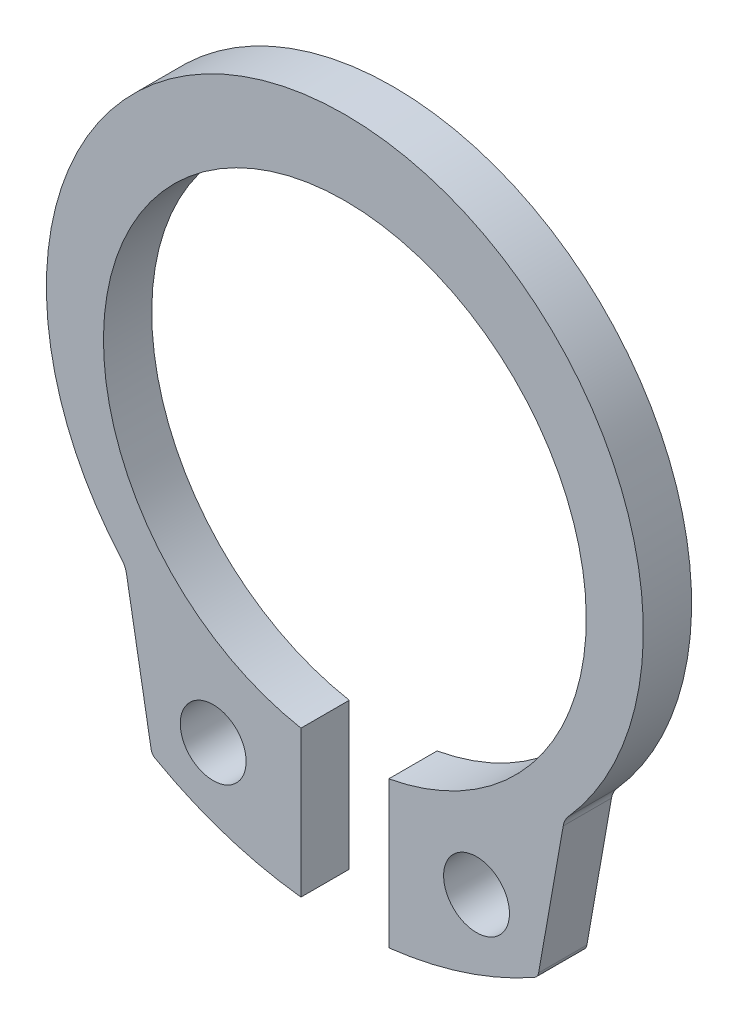
ISO-10303-21;
HEADER;
FILE_DESCRIPTION(('STEP AP214'),'2;1');
FILE_NAME('part.step','',(''),(''),'','','');
FILE_SCHEMA(('AUTOMOTIVE_DESIGN { 1 0 10303 214 1 1 1 1 }'));
ENDSEC;
DATA;
#1=APPLICATION_CONTEXT('core data for automotive mechanical design processes');
#2=APPLICATION_PROTOCOL_DEFINITION('international standard','automotive_design',2000,#1);
#3=PRODUCT_CONTEXT('',#1,'mechanical');
#4=PRODUCT('Part','Part','',(#3));
#5=PRODUCT_RELATED_PRODUCT_CATEGORY('part','',(#4));
#6=PRODUCT_DEFINITION_FORMATION('','',#4);
#7=PRODUCT_DEFINITION_CONTEXT('part definition',#1,'design');
#8=PRODUCT_DEFINITION('design','',#6,#7);
#9=PRODUCT_DEFINITION_SHAPE('','',#8);
#10=(LENGTH_UNIT() NAMED_UNIT(*) SI_UNIT(.MILLI.,.METRE.));
#11=(NAMED_UNIT(*) PLANE_ANGLE_UNIT() SI_UNIT($,.RADIAN.));
#12=(NAMED_UNIT(*) SI_UNIT($,.STERADIAN.) SOLID_ANGLE_UNIT());
#13=UNCERTAINTY_MEASURE_WITH_UNIT(LENGTH_MEASURE(1.E-05),#10,'distance_accuracy_value','');
#14=(GEOMETRIC_REPRESENTATION_CONTEXT(3) GLOBAL_UNCERTAINTY_ASSIGNED_CONTEXT((#13)) GLOBAL_UNIT_ASSIGNED_CONTEXT((#10,
#11,#12)) REPRESENTATION_CONTEXT('',''));
#15=CARTESIAN_POINT('',(0.,0.,0.));
#16=DIRECTION('',(0.,0.,1.));
#17=DIRECTION('',(1.,0.,0.));
#18=AXIS2_PLACEMENT_3D('',#15,#16,#17);
#19=CARTESIAN_POINT('',(5.46744745290776,-4.83704644899059,1.1));
#20=DIRECTION('',(0.,0.,-1.));
#21=DIRECTION('',(-1.,0.,0.));
#22=AXIS2_PLACEMENT_3D('',#19,#20,#21);
#23=CYLINDRICAL_SURFACE('',#22,0.500000000000001);
#24=CARTESIAN_POINT('',(5.46744745290776,-4.83704644899059,0.));
#25=DIRECTION('',(0.,0.,1.));
#26=DIRECTION('',(1.,0.,0.));
#27=AXIS2_PLACEMENT_3D('',#24,#25,#26);
#28=CIRCLE('',#27,0.500000000000001);
#29=CARTESIAN_POINT('',(4.97504357640166,-4.75022236015712,0.));
#30=VERTEX_POINT('',#29);
#31=CARTESIAN_POINT('',(5.0929647506538,-4.50574189768986,0.));
#32=VERTEX_POINT('',#31);
#33=EDGE_CURVE('E169',#30,#32,#28,.F.);
#34=ORIENTED_EDGE('',*,*,#33,.T.);
#35=DIRECTION('',(0.,0.,-1.));
#36=VECTOR('',#35,1.);
#37=CARTESIAN_POINT('',(5.0929647506538,-4.50574189768986,1.1));
#38=LINE('',#37,#36);
#39=CARTESIAN_POINT('',(5.0929647506538,-4.50574189768986,1.1));
#40=VERTEX_POINT('',#39);
#41=EDGE_CURVE('E11',#40,#32,#38,.T.);
#42=ORIENTED_EDGE('',*,*,#41,.F.);
#43=CARTESIAN_POINT('',(5.46744745290776,-4.83704644899059,1.1));
#44=DIRECTION('',(0.,0.,1.));
#45=DIRECTION('',(1.,0.,0.));
#46=AXIS2_PLACEMENT_3D('',#43,#44,#45);
#47=CIRCLE('',#46,0.500000000000001);
#48=CARTESIAN_POINT('',(4.97504357640166,-4.75022236015712,1.1));
#49=VERTEX_POINT('',#48);
#50=EDGE_CURVE('E306',#49,#40,#47,.F.);
#51=ORIENTED_EDGE('',*,*,#50,.F.);
#52=DIRECTION('',(0.,0.,-1.));
#53=VECTOR('',#52,1.);
#54=CARTESIAN_POINT('',(4.97504357640166,-4.75022236015712,1.1));
#55=LINE('',#54,#53);
#56=EDGE_CURVE('E58',#49,#30,#55,.T.);
#57=ORIENTED_EDGE('',*,*,#56,.T.);
#58=EDGE_LOOP('',(#34,#42,#51,#57));
#59=FACE_BOUND('',#58,.T.);
#60=ADVANCED_FACE('F41',(#59),#23,.F.);
#61=CARTESIAN_POINT('',(0.,0.,1.1));
#62=DIRECTION('',(0.,0.,-1.));
#63=DIRECTION('',(-1.,0.,0.));
#64=AXIS2_PLACEMENT_3D('',#61,#62,#63);
#65=CYLINDRICAL_SURFACE('',#64,6.8);
#66=CARTESIAN_POINT('',(0.,0.,0.));
#67=DIRECTION('',(0.,0.,1.));
#68=DIRECTION('',(1.,0.,0.));
#69=AXIS2_PLACEMENT_3D('',#66,#67,#68);
#70=CIRCLE('',#69,6.8);
#71=CARTESIAN_POINT('',(-5.0929647506538,-4.50574189768986,0.));
#72=VERTEX_POINT('',#71);
#73=EDGE_CURVE('E171',#32,#72,#70,.T.);
#74=ORIENTED_EDGE('',*,*,#73,.T.);
#75=DIRECTION('',(0.,0.,-1.));
#76=VECTOR('',#75,1.);
#77=CARTESIAN_POINT('',(-5.0929647506538,-4.50574189768986,1.1));
#78=LINE('',#77,#76);
#79=CARTESIAN_POINT('',(-5.0929647506538,-4.50574189768986,1.1));
#80=VERTEX_POINT('',#79);
#81=EDGE_CURVE('E50',#80,#72,#78,.T.);
#82=ORIENTED_EDGE('',*,*,#81,.F.);
#83=CARTESIAN_POINT('',(0.,0.,1.1));
#84=DIRECTION('',(0.,0.,1.));
#85=DIRECTION('',(1.,0.,0.));
#86=AXIS2_PLACEMENT_3D('',#83,#84,#85);
#87=CIRCLE('',#86,6.8);
#88=EDGE_CURVE('E108',#40,#80,#87,.T.);
#89=ORIENTED_EDGE('',*,*,#88,.F.);
#90=ORIENTED_EDGE('',*,*,#41,.T.);
#91=EDGE_LOOP('',(#74,#82,#89,#90));
#92=FACE_BOUND('',#91,.T.);
#93=ADVANCED_FACE('F222',(#92),#65,.T.);
#94=CARTESIAN_POINT('',(-5.46744745290776,-4.83704644899059,1.1));
#95=DIRECTION('',(0.,0.,-1.));
#96=DIRECTION('',(-1.,0.,0.));
#97=AXIS2_PLACEMENT_3D('',#94,#95,#96);
#98=CYLINDRICAL_SURFACE('',#97,0.500000000000001);
#99=CARTESIAN_POINT('',(-5.46744745290776,-4.83704644899059,0.));
#100=DIRECTION('',(0.,0.,1.));
#101=DIRECTION('',(1.,0.,0.));
#102=AXIS2_PLACEMENT_3D('',#99,#100,#101);
#103=CIRCLE('',#102,0.500000000000001);
#104=CARTESIAN_POINT('',(-4.97504357640166,-4.75022236015712,0.));
#105=VERTEX_POINT('',#104);
#106=EDGE_CURVE('E174',#105,#72,#103,.T.);
#107=ORIENTED_EDGE('',*,*,#106,.F.);
#108=DIRECTION('',(0.,0.,-1.));
#109=VECTOR('',#108,1.);
#110=CARTESIAN_POINT('',(-4.97504357640166,-4.75022236015712,1.1));
#111=LINE('',#110,#109);
#112=CARTESIAN_POINT('',(-4.97504357640166,-4.75022236015712,1.1));
#113=VERTEX_POINT('',#112);
#114=EDGE_CURVE('E215',#113,#105,#111,.T.);
#115=ORIENTED_EDGE('',*,*,#114,.F.);
#116=CARTESIAN_POINT('',(-5.46744745290776,-4.83704644899059,1.1));
#117=DIRECTION('',(0.,0.,1.));
#118=DIRECTION('',(1.,0.,0.));
#119=AXIS2_PLACEMENT_3D('',#116,#117,#118);
#120=CIRCLE('',#119,0.500000000000001);
#121=EDGE_CURVE('E221',#113,#80,#120,.T.);
#122=ORIENTED_EDGE('',*,*,#121,.T.);
#123=ORIENTED_EDGE('',*,*,#81,.T.);
#124=EDGE_LOOP('',(#107,#115,#122,#123));
#125=FACE_BOUND('',#124,.T.);
#126=ADVANCED_FACE('F219',(#125),#98,.F.);
#127=CARTESIAN_POINT('',(-5.63736352284218,-0.994019289138806,1.1));
#128=DIRECTION('',(0.984807753012208,0.173648177666932,0.));
#129=DIRECTION('',(-0.173648177666932,0.984807753012208,0.));
#130=AXIS2_PLACEMENT_3D('',#127,#128,#129);
#131=PLANE('',#130);
#132=DIRECTION('',(0.173648177666932,-0.984807753012208,0.));
#133=VECTOR('',#132,1.);
#134=CARTESIAN_POINT('',(-5.63736352284218,-0.994019289138806,0.));
#135=LINE('',#134,#133);
#136=CARTESIAN_POINT('',(-4.41443549590344,-7.92958877501741,0.));
#137=VERTEX_POINT('',#136);
#138=EDGE_CURVE('E177',#105,#137,#135,.T.);
#139=ORIENTED_EDGE('',*,*,#138,.T.);
#140=DIRECTION('',(0.,0.,-1.));
#141=VECTOR('',#140,1.);
#142=CARTESIAN_POINT('',(-4.41443549590344,-7.92958877501741,1.1));
#143=LINE('',#142,#141);
#144=CARTESIAN_POINT('',(-4.41443549590344,-7.92958877501741,1.1));
#145=VERTEX_POINT('',#144);
#146=EDGE_CURVE('E212',#145,#137,#143,.T.);
#147=ORIENTED_EDGE('',*,*,#146,.F.);
#148=DIRECTION('',(0.173648177666932,-0.984807753012208,0.));
#149=VECTOR('',#148,1.);
#150=CARTESIAN_POINT('',(-5.63736352284218,-0.994019289138806,1.1));
#151=LINE('',#150,#149);
#152=EDGE_CURVE('E240',#113,#145,#151,.T.);
#153=ORIENTED_EDGE('',*,*,#152,.F.);
#154=ORIENTED_EDGE('',*,*,#114,.T.);
#155=EDGE_LOOP('',(#139,#147,#153,#154));
#156=FACE_BOUND('',#155,.T.);
#157=ADVANCED_FACE('F231',(#156),#131,.F.);
#158=CARTESIAN_POINT('',(-4.217473945301,-7.89485913948402,1.1));
#159=DIRECTION('',(0.,0.,-1.));
#160=DIRECTION('',(-1.,0.,0.));
#161=AXIS2_PLACEMENT_3D('',#158,#159,#160);
#162=CYLINDRICAL_SURFACE('',#161,0.200000000000001);
#163=CARTESIAN_POINT('',(-4.217473945301,-7.89485913948402,0.));
#164=DIRECTION('',(0.,0.,1.));
#165=DIRECTION('',(1.,0.,0.));
#166=AXIS2_PLACEMENT_3D('',#163,#164,#165);
#167=CIRCLE('',#166,0.200000000000001);
#168=CARTESIAN_POINT('',(-4.3155547347266,-8.06915818923947,0.));
#169=VERTEX_POINT('',#168);
#170=EDGE_CURVE('E179',#137,#169,#167,.T.);
#171=ORIENTED_EDGE('',*,*,#170,.T.);
#172=DIRECTION('',(0.,0.,-1.));
#173=VECTOR('',#172,1.);
#174=CARTESIAN_POINT('',(-4.3155547347266,-8.06915818923947,1.1));
#175=LINE('',#174,#173);
#176=CARTESIAN_POINT('',(-4.3155547347266,-8.06915818923947,1.1));
#177=VERTEX_POINT('',#176);
#178=EDGE_CURVE('E209',#177,#169,#175,.T.);
#179=ORIENTED_EDGE('',*,*,#178,.F.);
#180=CARTESIAN_POINT('',(-4.217473945301,-7.89485913948402,1.1));
#181=DIRECTION('',(0.,0.,1.));
#182=DIRECTION('',(1.,0.,0.));
#183=AXIS2_PLACEMENT_3D('',#180,#181,#182);
#184=CIRCLE('',#183,0.200000000000001);
#185=EDGE_CURVE('E237',#145,#177,#184,.T.);
#186=ORIENTED_EDGE('',*,*,#185,.F.);
#187=ORIENTED_EDGE('',*,*,#146,.T.);
#188=EDGE_LOOP('',(#171,#179,#186,#187));
#189=FACE_BOUND('',#188,.T.);
#190=ADVANCED_FACE('F235',(#189),#162,.T.);
#191=CARTESIAN_POINT('',(0.,-0.4,1.1));
#192=DIRECTION('',(0.,0.,-1.));
#193=DIRECTION('',(-1.,0.,0.));
#194=AXIS2_PLACEMENT_3D('',#191,#192,#193);
#195=CYLINDRICAL_SURFACE('',#194,8.8);
#196=CARTESIAN_POINT('',(0.,-0.4,0.));
#197=DIRECTION('',(0.,0.,1.));
#198=DIRECTION('',(1.,0.,0.));
#199=AXIS2_PLACEMENT_3D('',#196,#197,#198);
#200=CIRCLE('',#199,8.8);
#201=CARTESIAN_POINT('',(-0.999999999999999,-9.14299719775776,0.));
#202=VERTEX_POINT('',#201);
#203=EDGE_CURVE('E181',#169,#202,#200,.T.);
#204=ORIENTED_EDGE('',*,*,#203,.T.);
#205=DIRECTION('',(0.,0.,-1.));
#206=VECTOR('',#205,1.);
#207=CARTESIAN_POINT('',(-0.999999999999999,-9.14299719775776,1.1));
#208=LINE('',#207,#206);
#209=CARTESIAN_POINT('',(-0.999999999999999,-9.14299719775776,1.1));
#210=VERTEX_POINT('',#209);
#211=EDGE_CURVE('E207',#210,#202,#208,.T.);
#212=ORIENTED_EDGE('',*,*,#211,.F.);
#213=CARTESIAN_POINT('',(0.,-0.4,1.1));
#214=DIRECTION('',(0.,0.,1.));
#215=DIRECTION('',(1.,0.,0.));
#216=AXIS2_PLACEMENT_3D('',#213,#214,#215);
#217=CIRCLE('',#216,8.8);
#218=EDGE_CURVE('E239',#177,#210,#217,.T.);
#219=ORIENTED_EDGE('',*,*,#218,.F.);
#220=ORIENTED_EDGE('',*,*,#178,.T.);
#221=EDGE_LOOP('',(#204,#212,#219,#220));
#222=FACE_BOUND('',#221,.T.);
#223=ADVANCED_FACE('F375',(#222),#195,.T.);
#224=CARTESIAN_POINT('',(-1.,0.,1.1));
#225=DIRECTION('',(1.,0.,0.));
#226=DIRECTION('',(0.,1.,0.));
#227=AXIS2_PLACEMENT_3D('',#224,#225,#226);
#228=PLANE('',#227);
#229=DIRECTION('',(0.,-1.,0.));
#230=VECTOR('',#229,1.);
#231=CARTESIAN_POINT('',(-1.,0.,0.));
#232=LINE('',#231,#230);
#233=CARTESIAN_POINT('',(-0.999999999999999,-5.80832691319598,0.));
#234=VERTEX_POINT('',#233);
#235=EDGE_CURVE('E184',#234,#202,#232,.T.);
#236=ORIENTED_EDGE('',*,*,#235,.F.);
#237=DIRECTION('',(0.,0.,-1.));
#238=VECTOR('',#237,1.);
#239=CARTESIAN_POINT('',(-0.999999999999999,-5.80832691319598,1.1));
#240=LINE('',#239,#238);
#241=CARTESIAN_POINT('',(-0.999999999999999,-5.80832691319598,1.1));
#242=VERTEX_POINT('',#241);
#243=EDGE_CURVE('E205',#242,#234,#240,.T.);
#244=ORIENTED_EDGE('',*,*,#243,.F.);
#245=DIRECTION('',(0.,-1.,0.));
#246=VECTOR('',#245,1.);
#247=CARTESIAN_POINT('',(-1.,0.,1.1));
#248=LINE('',#247,#246);
#249=EDGE_CURVE('E242',#242,#210,#248,.T.);
#250=ORIENTED_EDGE('',*,*,#249,.T.);
#251=ORIENTED_EDGE('',*,*,#211,.T.);
#252=EDGE_LOOP('',(#236,#244,#250,#251));
#253=FACE_BOUND('',#252,.T.);
#254=ADVANCED_FACE('F258',(#253),#228,.T.);
#255=CARTESIAN_POINT('',(0.,-0.4,1.1));
#256=DIRECTION('',(0.,0.,-1.));
#257=DIRECTION('',(-1.,0.,0.));
#258=AXIS2_PLACEMENT_3D('',#255,#256,#257);
#259=CYLINDRICAL_SURFACE('',#258,5.5);
#260=CARTESIAN_POINT('',(0.,-0.4,0.));
#261=DIRECTION('',(0.,0.,1.));
#262=DIRECTION('',(1.,0.,0.));
#263=AXIS2_PLACEMENT_3D('',#260,#261,#262);
#264=CIRCLE('',#263,5.5);
#265=CARTESIAN_POINT('',(0.999999999999999,-5.80832691319598,0.));
#266=VERTEX_POINT('',#265);
#267=EDGE_CURVE('E187',#266,#234,#264,.T.);
#268=ORIENTED_EDGE('',*,*,#267,.F.);
#269=DIRECTION('',(0.,0.,-1.));
#270=VECTOR('',#269,1.);
#271=CARTESIAN_POINT('',(0.999999999999999,-5.80832691319598,1.1));
#272=LINE('',#271,#270);
#273=CARTESIAN_POINT('',(0.999999999999999,-5.80832691319598,1.1));
#274=VERTEX_POINT('',#273);
#275=EDGE_CURVE('E203',#274,#266,#272,.T.);
#276=ORIENTED_EDGE('',*,*,#275,.F.);
#277=CARTESIAN_POINT('',(0.,-0.4,1.1));
#278=DIRECTION('',(0.,0.,1.));
#279=DIRECTION('',(1.,0.,0.));
#280=AXIS2_PLACEMENT_3D('',#277,#278,#279);
#281=CIRCLE('',#280,5.5);
#282=EDGE_CURVE('E249',#274,#242,#281,.T.);
#283=ORIENTED_EDGE('',*,*,#282,.T.);
#284=ORIENTED_EDGE('',*,*,#243,.T.);
#285=EDGE_LOOP('',(#268,#276,#283,#284));
#286=FACE_BOUND('',#285,.T.);
#287=ADVANCED_FACE('F253',(#286),#259,.F.);
#288=CARTESIAN_POINT('',(1.,0.,1.1));
#289=DIRECTION('',(1.,0.,0.));
#290=DIRECTION('',(0.,1.,0.));
#291=AXIS2_PLACEMENT_3D('',#288,#289,#290);
#292=PLANE('',#291);
#293=DIRECTION('',(0.,-1.,0.));
#294=VECTOR('',#293,1.);
#295=CARTESIAN_POINT('',(1.,0.,0.));
#296=LINE('',#295,#294);
#297=CARTESIAN_POINT('',(0.999999999999999,-9.14299719775776,0.));
#298=VERTEX_POINT('',#297);
#299=EDGE_CURVE('E190',#266,#298,#296,.T.);
#300=ORIENTED_EDGE('',*,*,#299,.T.);
#301=DIRECTION('',(0.,0.,-1.));
#302=VECTOR('',#301,1.);
#303=CARTESIAN_POINT('',(0.999999999999999,-9.14299719775776,1.1));
#304=LINE('',#303,#302);
#305=CARTESIAN_POINT('',(0.999999999999999,-9.14299719775776,1.1));
#306=VERTEX_POINT('',#305);
#307=EDGE_CURVE('E145',#306,#298,#304,.T.);
#308=ORIENTED_EDGE('',*,*,#307,.F.);
#309=DIRECTION('',(0.,-1.,0.));
#310=VECTOR('',#309,1.);
#311=CARTESIAN_POINT('',(1.,0.,1.1));
#312=LINE('',#311,#310);
#313=EDGE_CURVE('E154',#274,#306,#312,.T.);
#314=ORIENTED_EDGE('',*,*,#313,.F.);
#315=ORIENTED_EDGE('',*,*,#275,.T.);
#316=EDGE_LOOP('',(#300,#308,#314,#315));
#317=FACE_BOUND('',#316,.T.);
#318=ADVANCED_FACE('F261',(#317),#292,.F.);
#319=CARTESIAN_POINT('',(0.,-0.4,1.1));
#320=DIRECTION('',(0.,0.,-1.));
#321=DIRECTION('',(-1.,0.,0.));
#322=AXIS2_PLACEMENT_3D('',#319,#320,#321);
#323=CYLINDRICAL_SURFACE('',#322,8.8);
#324=CARTESIAN_POINT('',(0.,-0.4,0.));
#325=DIRECTION('',(0.,0.,1.));
#326=DIRECTION('',(1.,0.,0.));
#327=AXIS2_PLACEMENT_3D('',#324,#325,#326);
#328=CIRCLE('',#327,8.8);
#329=CARTESIAN_POINT('',(4.3155547347266,-8.06915818923947,0.));
#330=VERTEX_POINT('',#329);
#331=EDGE_CURVE('E141',#330,#298,#328,.F.);
#332=ORIENTED_EDGE('',*,*,#331,.F.);
#333=DIRECTION('',(0.,0.,-1.));
#334=VECTOR('',#333,1.);
#335=CARTESIAN_POINT('',(4.3155547347266,-8.06915818923947,1.1));
#336=LINE('',#335,#334);
#337=CARTESIAN_POINT('',(4.3155547347266,-8.06915818923947,1.1));
#338=VERTEX_POINT('',#337);
#339=EDGE_CURVE('E136',#338,#330,#336,.T.);
#340=ORIENTED_EDGE('',*,*,#339,.F.);
#341=CARTESIAN_POINT('',(0.,-0.4,1.1));
#342=DIRECTION('',(0.,0.,1.));
#343=DIRECTION('',(1.,0.,0.));
#344=AXIS2_PLACEMENT_3D('',#341,#342,#343);
#345=CIRCLE('',#344,8.8);
#346=EDGE_CURVE('E139',#338,#306,#345,.F.);
#347=ORIENTED_EDGE('',*,*,#346,.T.);
#348=ORIENTED_EDGE('',*,*,#307,.T.);
#349=EDGE_LOOP('',(#332,#340,#347,#348));
#350=FACE_BOUND('',#349,.T.);
#351=ADVANCED_FACE('F138',(#350),#323,.T.);
#352=CARTESIAN_POINT('',(4.217473945301,-7.89485913948402,1.1));
#353=DIRECTION('',(0.,0.,-1.));
#354=DIRECTION('',(-1.,0.,0.));
#355=AXIS2_PLACEMENT_3D('',#352,#353,#354);
#356=CYLINDRICAL_SURFACE('',#355,0.200000000000001);
#357=CARTESIAN_POINT('',(4.217473945301,-7.89485913948402,0.));
#358=DIRECTION('',(0.,0.,1.));
#359=DIRECTION('',(1.,0.,0.));
#360=AXIS2_PLACEMENT_3D('',#357,#358,#359);
#361=CIRCLE('',#360,0.200000000000001);
#362=CARTESIAN_POINT('',(4.41443549590344,-7.92958877501741,0.));
#363=VERTEX_POINT('',#362);
#364=EDGE_CURVE('E194',#363,#330,#361,.F.);
#365=ORIENTED_EDGE('',*,*,#364,.F.);
#366=DIRECTION('',(0.,0.,-1.));
#367=VECTOR('',#366,1.);
#368=CARTESIAN_POINT('',(4.41443549590344,-7.92958877501741,1.1));
#369=LINE('',#368,#367);
#370=CARTESIAN_POINT('',(4.41443549590344,-7.92958877501741,1.1));
#371=VERTEX_POINT('',#370);
#372=EDGE_CURVE('E96',#371,#363,#369,.T.);
#373=ORIENTED_EDGE('',*,*,#372,.F.);
#374=CARTESIAN_POINT('',(4.217473945301,-7.89485913948402,1.1));
#375=DIRECTION('',(0.,0.,1.));
#376=DIRECTION('',(1.,0.,0.));
#377=AXIS2_PLACEMENT_3D('',#374,#375,#376);
#378=CIRCLE('',#377,0.200000000000001);
#379=EDGE_CURVE('E151',#371,#338,#378,.F.);
#380=ORIENTED_EDGE('',*,*,#379,.T.);
#381=ORIENTED_EDGE('',*,*,#339,.T.);
#382=EDGE_LOOP('',(#365,#373,#380,#381));
#383=FACE_BOUND('',#382,.T.);
#384=ADVANCED_FACE('F157',(#383),#356,.T.);
#385=CARTESIAN_POINT('',(-3.,-7.09347756844978,1.1));
#386=DIRECTION('',(0.,0.,-1.));
#387=DIRECTION('',(-1.,0.,0.));
#388=AXIS2_PLACEMENT_3D('',#385,#386,#387);
#389=CYLINDRICAL_SURFACE('',#388,0.75);
#390=CARTESIAN_POINT('',(-3.,-7.09347756844978,1.1));
#391=DIRECTION('',(0.,0.,1.));
#392=DIRECTION('',(1.,0.,0.));
#393=AXIS2_PLACEMENT_3D('',#390,#391,#392);
#394=CIRCLE('',#393,0.75);
#395=CARTESIAN_POINT('',(-2.25,-7.09347756844978,1.1));
#396=VERTEX_POINT('',#395);
#397=EDGE_CURVE('E290',#396,#396,#394,.T.);
#398=ORIENTED_EDGE('',*,*,#397,.T.);
#399=EDGE_LOOP('',(#398));
#400=FACE_BOUND('',#399,.T.);
#401=CARTESIAN_POINT('',(-3.,-7.09347756844978,0.));
#402=DIRECTION('',(0.,0.,1.));
#403=DIRECTION('',(1.,0.,0.));
#404=AXIS2_PLACEMENT_3D('',#401,#402,#403);
#405=CIRCLE('',#404,0.75);
#406=CARTESIAN_POINT('',(-2.25,-7.09347756844978,0.));
#407=VERTEX_POINT('',#406);
#408=EDGE_CURVE('E166',#407,#407,#405,.T.);
#409=ORIENTED_EDGE('',*,*,#408,.F.);
#410=EDGE_LOOP('',(#409));
#411=FACE_BOUND('',#410,.T.);
#412=ADVANCED_FACE('F277',(#400,#411),#389,.F.);
#413=CARTESIAN_POINT('',(3.,-7.09347756844978,1.1));
#414=DIRECTION('',(0.,0.,-1.));
#415=DIRECTION('',(-1.,0.,0.));
#416=AXIS2_PLACEMENT_3D('',#413,#414,#415);
#417=CYLINDRICAL_SURFACE('',#416,0.75);
#418=CARTESIAN_POINT('',(3.,-7.09347756844978,1.1));
#419=DIRECTION('',(0.,0.,1.));
#420=DIRECTION('',(1.,0.,0.));
#421=AXIS2_PLACEMENT_3D('',#418,#419,#420);
#422=CIRCLE('',#421,0.75);
#423=CARTESIAN_POINT('',(3.75,-7.09347756844978,1.1));
#424=VERTEX_POINT('',#423);
#425=EDGE_CURVE('E199',#424,#424,#422,.F.);
#426=ORIENTED_EDGE('',*,*,#425,.F.);
#427=EDGE_LOOP('',(#426));
#428=FACE_BOUND('',#427,.T.);
#429=CARTESIAN_POINT('',(3.,-7.09347756844978,0.));
#430=DIRECTION('',(0.,0.,1.));
#431=DIRECTION('',(1.,0.,0.));
#432=AXIS2_PLACEMENT_3D('',#429,#430,#431);
#433=CIRCLE('',#432,0.75);
#434=CARTESIAN_POINT('',(3.75,-7.09347756844978,0.));
#435=VERTEX_POINT('',#434);
#436=EDGE_CURVE('E163',#435,#435,#433,.F.);
#437=ORIENTED_EDGE('',*,*,#436,.T.);
#438=EDGE_LOOP('',(#437));
#439=FACE_BOUND('',#438,.T.);
#440=ADVANCED_FACE('F43',(#428,#439),#417,.F.);
#441=CARTESIAN_POINT('',(5.63736352284218,-0.994019289138806,1.1));
#442=DIRECTION('',(0.984807753012208,-0.173648177666932,0.));
#443=DIRECTION('',(0.173648177666932,0.984807753012208,0.));
#444=AXIS2_PLACEMENT_3D('',#441,#442,#443);
#445=PLANE('',#444);
#446=DIRECTION('',(-0.173648177666932,-0.984807753012208,0.));
#447=VECTOR('',#446,1.);
#448=CARTESIAN_POINT('',(5.63736352284218,-0.994019289138806,0.));
#449=LINE('',#448,#447);
#450=EDGE_CURVE('E196',#30,#363,#449,.T.);
#451=ORIENTED_EDGE('',*,*,#450,.F.);
#452=ORIENTED_EDGE('',*,*,#56,.F.);
#453=DIRECTION('',(-0.173648177666932,-0.984807753012208,0.));
#454=VECTOR('',#453,1.);
#455=CARTESIAN_POINT('',(5.63736352284218,-0.994019289138806,1.1));
#456=LINE('',#455,#454);
#457=EDGE_CURVE('E158',#49,#371,#456,.T.);
#458=ORIENTED_EDGE('',*,*,#457,.T.);
#459=ORIENTED_EDGE('',*,*,#372,.T.);
#460=EDGE_LOOP('',(#451,#452,#458,#459));
#461=FACE_BOUND('',#460,.T.);
#462=ADVANCED_FACE('F284',(#461),#445,.T.);
#463=CARTESIAN_POINT('',(0.,0.,1.1));
#464=DIRECTION('',(0.,0.,1.));
#465=DIRECTION('',(1.,0.,0.));
#466=AXIS2_PLACEMENT_3D('',#463,#464,#465);
#467=PLANE('',#466);
#468=ORIENTED_EDGE('',*,*,#425,.T.);
#469=EDGE_LOOP('',(#468));
#470=FACE_BOUND('',#469,.T.);
#471=ORIENTED_EDGE('',*,*,#397,.F.);
#472=EDGE_LOOP('',(#471));
#473=FACE_BOUND('',#472,.T.);
#474=ORIENTED_EDGE('',*,*,#50,.T.);
#475=ORIENTED_EDGE('',*,*,#88,.T.);
#476=ORIENTED_EDGE('',*,*,#121,.F.);
#477=ORIENTED_EDGE('',*,*,#152,.T.);
#478=ORIENTED_EDGE('',*,*,#185,.T.);
#479=ORIENTED_EDGE('',*,*,#218,.T.);
#480=ORIENTED_EDGE('',*,*,#249,.F.);
#481=ORIENTED_EDGE('',*,*,#282,.F.);
#482=ORIENTED_EDGE('',*,*,#313,.T.);
#483=ORIENTED_EDGE('',*,*,#346,.F.);
#484=ORIENTED_EDGE('',*,*,#379,.F.);
#485=ORIENTED_EDGE('',*,*,#457,.F.);
#486=EDGE_LOOP('',(#474,#475,#476,#477,#478,#479,#480,#481,#482,#483,#484,#485));
#487=FACE_BOUND('',#486,.T.);
#488=ADVANCED_FACE('F149',(#470,#473,#487),#467,.T.);
#489=CARTESIAN_POINT('',(0.,0.,0.));
#490=DIRECTION('',(0.,0.,1.));
#491=DIRECTION('',(1.,0.,0.));
#492=AXIS2_PLACEMENT_3D('',#489,#490,#491);
#493=PLANE('',#492);
#494=ORIENTED_EDGE('',*,*,#436,.F.);
#495=EDGE_LOOP('',(#494));
#496=FACE_BOUND('',#495,.T.);
#497=ORIENTED_EDGE('',*,*,#408,.T.);
#498=EDGE_LOOP('',(#497));
#499=FACE_BOUND('',#498,.T.);
#500=ORIENTED_EDGE('',*,*,#33,.F.);
#501=ORIENTED_EDGE('',*,*,#450,.T.);
#502=ORIENTED_EDGE('',*,*,#364,.T.);
#503=ORIENTED_EDGE('',*,*,#331,.T.);
#504=ORIENTED_EDGE('',*,*,#299,.F.);
#505=ORIENTED_EDGE('',*,*,#267,.T.);
#506=ORIENTED_EDGE('',*,*,#235,.T.);
#507=ORIENTED_EDGE('',*,*,#203,.F.);
#508=ORIENTED_EDGE('',*,*,#170,.F.);
#509=ORIENTED_EDGE('',*,*,#138,.F.);
#510=ORIENTED_EDGE('',*,*,#106,.T.);
#511=ORIENTED_EDGE('',*,*,#73,.F.);
#512=EDGE_LOOP('',(#500,#501,#502,#503,#504,#505,#506,#507,#508,#509,#510,#511));
#513=FACE_BOUND('',#512,.T.);
#514=ADVANCED_FACE('F226',(#496,#499,#513),#493,.F.);
#515=CLOSED_SHELL('',(#60,#93,#126,#157,#190,#223,#254,#287,#318,#351,#384,#412,#440,#462,#488,#514));
#516=MANIFOLD_SOLID_BREP('B2',#515);
#517=ADVANCED_BREP_SHAPE_REPRESENTATION('',(#18,#516),#14);
#518=SHAPE_DEFINITION_REPRESENTATION(#9,#517);
ENDSEC;
END-ISO-10303-21;
